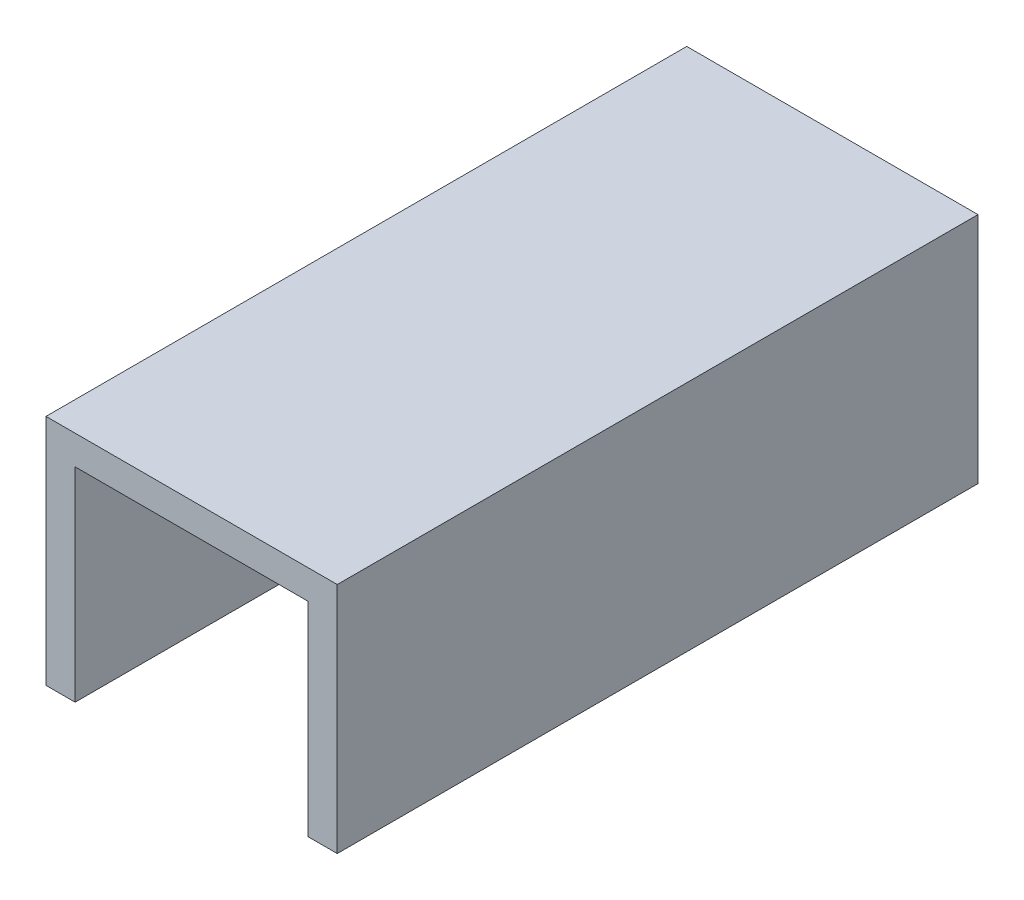
ISO-10303-21;
HEADER;
FILE_DESCRIPTION(('STEP AP214'),'2;1');
FILE_NAME('part.step','',(''),(''),'','','');
FILE_SCHEMA(('AUTOMOTIVE_DESIGN { 1 0 10303 214 1 1 1 1 }'));
ENDSEC;
DATA;
#1=APPLICATION_CONTEXT('core data for automotive mechanical design processes');
#2=APPLICATION_PROTOCOL_DEFINITION('international standard','automotive_design',2000,#1);
#3=PRODUCT_CONTEXT('',#1,'mechanical');
#4=PRODUCT('Part','Part','',(#3));
#5=PRODUCT_RELATED_PRODUCT_CATEGORY('part','',(#4));
#6=PRODUCT_DEFINITION_FORMATION('','',#4);
#7=PRODUCT_DEFINITION_CONTEXT('part definition',#1,'design');
#8=PRODUCT_DEFINITION('design','',#6,#7);
#9=PRODUCT_DEFINITION_SHAPE('','',#8);
#10=(LENGTH_UNIT() NAMED_UNIT(*) SI_UNIT(.MILLI.,.METRE.));
#11=(NAMED_UNIT(*) PLANE_ANGLE_UNIT() SI_UNIT($,.RADIAN.));
#12=(NAMED_UNIT(*) SI_UNIT($,.STERADIAN.) SOLID_ANGLE_UNIT());
#13=UNCERTAINTY_MEASURE_WITH_UNIT(LENGTH_MEASURE(1.E-05),#10,'distance_accuracy_value','');
#14=(GEOMETRIC_REPRESENTATION_CONTEXT(3) GLOBAL_UNCERTAINTY_ASSIGNED_CONTEXT((#13)) GLOBAL_UNIT_ASSIGNED_CONTEXT((#10,
#11,#12)) REPRESENTATION_CONTEXT('',''));
#15=CARTESIAN_POINT('',(0.,0.,0.));
#16=DIRECTION('',(0.,0.,1.));
#17=DIRECTION('',(1.,0.,0.));
#18=AXIS2_PLACEMENT_3D('',#15,#16,#17);
#19=CARTESIAN_POINT('',(25.,20.,110.));
#20=DIRECTION('',(-1.,0.,0.));
#21=DIRECTION('',(0.,-1.,0.));
#22=AXIS2_PLACEMENT_3D('',#19,#20,#21);
#23=PLANE('',#22);
#24=DIRECTION('',(0.,1.,0.));
#25=VECTOR('',#24,1.);
#26=CARTESIAN_POINT('',(25.,20.,0.));
#27=LINE('',#26,#25);
#28=CARTESIAN_POINT('',(25.,-20.,0.));
#29=VERTEX_POINT('',#28);
#30=CARTESIAN_POINT('',(25.,20.,0.));
#31=VERTEX_POINT('',#30);
#32=EDGE_CURVE('E160',#29,#31,#27,.T.);
#33=ORIENTED_EDGE('',*,*,#32,.T.);
#34=DIRECTION('',(0.,0.,-1.));
#35=VECTOR('',#34,1.);
#36=CARTESIAN_POINT('',(25.,20.,110.));
#37=LINE('',#36,#35);
#38=CARTESIAN_POINT('',(25.,20.,110.));
#39=VERTEX_POINT('',#38);
#40=EDGE_CURVE('E11',#39,#31,#37,.T.);
#41=ORIENTED_EDGE('',*,*,#40,.F.);
#42=DIRECTION('',(0.,1.,0.));
#43=VECTOR('',#42,1.);
#44=CARTESIAN_POINT('',(25.,20.,110.));
#45=LINE('',#44,#43);
#46=CARTESIAN_POINT('',(25.,-20.,110.));
#47=VERTEX_POINT('',#46);
#48=EDGE_CURVE('E166',#47,#39,#45,.T.);
#49=ORIENTED_EDGE('',*,*,#48,.F.);
#50=DIRECTION('',(0.,0.,-1.));
#51=VECTOR('',#50,1.);
#52=CARTESIAN_POINT('',(25.,-20.,110.));
#53=LINE('',#52,#51);
#54=EDGE_CURVE('E177',#47,#29,#53,.T.);
#55=ORIENTED_EDGE('',*,*,#54,.T.);
#56=EDGE_LOOP('',(#33,#41,#49,#55));
#57=FACE_BOUND('',#56,.T.);
#58=ADVANCED_FACE('F43',(#57),#23,.F.);
#59=CARTESIAN_POINT('',(-25.,20.,110.));
#60=DIRECTION('',(0.,-1.,0.));
#61=DIRECTION('',(0.,0.,-1.));
#62=AXIS2_PLACEMENT_3D('',#59,#60,#61);
#63=PLANE('',#62);
#64=DIRECTION('',(-1.,0.,0.));
#65=VECTOR('',#64,1.);
#66=CARTESIAN_POINT('',(-25.,20.,0.));
#67=LINE('',#66,#65);
#68=CARTESIAN_POINT('',(-25.,20.,0.));
#69=VERTEX_POINT('',#68);
#70=EDGE_CURVE('E181',#31,#69,#67,.T.);
#71=ORIENTED_EDGE('',*,*,#70,.T.);
#72=DIRECTION('',(0.,0.,-1.));
#73=VECTOR('',#72,1.);
#74=CARTESIAN_POINT('',(-25.,20.,110.));
#75=LINE('',#74,#73);
#76=CARTESIAN_POINT('',(-25.,20.,110.));
#77=VERTEX_POINT('',#76);
#78=EDGE_CURVE('E51',#77,#69,#75,.T.);
#79=ORIENTED_EDGE('',*,*,#78,.F.);
#80=DIRECTION('',(-1.,0.,0.));
#81=VECTOR('',#80,1.);
#82=CARTESIAN_POINT('',(-25.,20.,110.));
#83=LINE('',#82,#81);
#84=EDGE_CURVE('E95',#39,#77,#83,.T.);
#85=ORIENTED_EDGE('',*,*,#84,.F.);
#86=ORIENTED_EDGE('',*,*,#40,.T.);
#87=EDGE_LOOP('',(#71,#79,#85,#86));
#88=FACE_BOUND('',#87,.T.);
#89=ADVANCED_FACE('F222',(#88),#63,.F.);
#90=CARTESIAN_POINT('',(-25.,20.,110.));
#91=DIRECTION('',(1.,0.,0.));
#92=DIRECTION('',(0.,1.,0.));
#93=AXIS2_PLACEMENT_3D('',#90,#91,#92);
#94=PLANE('',#93);
#95=DIRECTION('',(0.,-1.,0.));
#96=VECTOR('',#95,1.);
#97=CARTESIAN_POINT('',(-25.,20.,0.));
#98=LINE('',#97,#96);
#99=CARTESIAN_POINT('',(-25.,-20.,0.));
#100=VERTEX_POINT('',#99);
#101=EDGE_CURVE('E184',#69,#100,#98,.T.);
#102=ORIENTED_EDGE('',*,*,#101,.T.);
#103=DIRECTION('',(0.,0.,-1.));
#104=VECTOR('',#103,1.);
#105=CARTESIAN_POINT('',(-25.,-20.,110.));
#106=LINE('',#105,#104);
#107=CARTESIAN_POINT('',(-25.,-20.,110.));
#108=VERTEX_POINT('',#107);
#109=EDGE_CURVE('E191',#108,#100,#106,.T.);
#110=ORIENTED_EDGE('',*,*,#109,.F.);
#111=DIRECTION('',(0.,-1.,0.));
#112=VECTOR('',#111,1.);
#113=CARTESIAN_POINT('',(-25.,20.,110.));
#114=LINE('',#113,#112);
#115=EDGE_CURVE('E171',#77,#108,#114,.T.);
#116=ORIENTED_EDGE('',*,*,#115,.F.);
#117=ORIENTED_EDGE('',*,*,#78,.T.);
#118=EDGE_LOOP('',(#102,#110,#116,#117));
#119=FACE_BOUND('',#118,.T.);
#120=ADVANCED_FACE('F198',(#119),#94,.F.);
#121=CARTESIAN_POINT('',(-25.,-20.,110.));
#122=DIRECTION('',(0.,1.,0.));
#123=DIRECTION('',(0.,0.,1.));
#124=AXIS2_PLACEMENT_3D('',#121,#122,#123);
#125=PLANE('',#124);
#126=DIRECTION('',(1.,0.,0.));
#127=VECTOR('',#126,1.);
#128=CARTESIAN_POINT('',(-20.,-20.,5.));
#129=LINE('',#128,#127);
#130=CARTESIAN_POINT('',(-20.,-20.,5.));
#131=VERTEX_POINT('',#130);
#132=CARTESIAN_POINT('',(20.,-20.,5.));
#133=VERTEX_POINT('',#132);
#134=EDGE_CURVE('E135',#131,#133,#129,.T.);
#135=ORIENTED_EDGE('',*,*,#134,.F.);
#136=DIRECTION('',(0.,0.,1.));
#137=VECTOR('',#136,1.);
#138=CARTESIAN_POINT('',(-20.,-20.,5.));
#139=LINE('',#138,#137);
#140=CARTESIAN_POINT('',(-20.,-20.,110.));
#141=VERTEX_POINT('',#140);
#142=EDGE_CURVE('E118',#131,#141,#139,.T.);
#143=ORIENTED_EDGE('',*,*,#142,.T.);
#144=DIRECTION('',(1.,0.,0.));
#145=VECTOR('',#144,1.);
#146=CARTESIAN_POINT('',(-25.,-20.,110.));
#147=LINE('',#146,#145);
#148=EDGE_CURVE('E174',#108,#141,#147,.T.);
#149=ORIENTED_EDGE('',*,*,#148,.F.);
#150=ORIENTED_EDGE('',*,*,#109,.T.);
#151=DIRECTION('',(1.,0.,0.));
#152=VECTOR('',#151,1.);
#153=CARTESIAN_POINT('',(-25.,-20.,0.));
#154=LINE('',#153,#152);
#155=EDGE_CURVE('E88',#100,#29,#154,.T.);
#156=ORIENTED_EDGE('',*,*,#155,.T.);
#157=ORIENTED_EDGE('',*,*,#54,.F.);
#158=CARTESIAN_POINT('',(20.,-20.,110.));
#159=VERTEX_POINT('',#158);
#160=EDGE_CURVE('E66',#159,#47,#147,.T.);
#161=ORIENTED_EDGE('',*,*,#160,.F.);
#162=DIRECTION('',(0.,0.,1.));
#163=VECTOR('',#162,1.);
#164=CARTESIAN_POINT('',(20.,-20.,5.));
#165=LINE('',#164,#163);
#166=EDGE_CURVE('E58',#133,#159,#165,.T.);
#167=ORIENTED_EDGE('',*,*,#166,.F.);
#168=EDGE_LOOP('',(#135,#143,#149,#150,#156,#157,#161,#167));
#169=FACE_BOUND('',#168,.T.);
#170=ADVANCED_FACE('F140',(#169),#125,.F.);
#171=CARTESIAN_POINT('',(0.,0.,110.));
#172=DIRECTION('',(0.,0.,1.));
#173=DIRECTION('',(1.,0.,0.));
#174=AXIS2_PLACEMENT_3D('',#171,#172,#173);
#175=PLANE('',#174);
#176=DIRECTION('',(0.,-1.,0.));
#177=VECTOR('',#176,1.);
#178=CARTESIAN_POINT('',(-20.,-20.,110.));
#179=LINE('',#178,#177);
#180=CARTESIAN_POINT('',(-20.,15.,110.));
#181=VERTEX_POINT('',#180);
#182=EDGE_CURVE('E124',#181,#141,#179,.T.);
#183=ORIENTED_EDGE('',*,*,#182,.F.);
#184=DIRECTION('',(-1.,0.,0.));
#185=VECTOR('',#184,1.);
#186=CARTESIAN_POINT('',(-20.,15.,110.));
#187=LINE('',#186,#185);
#188=CARTESIAN_POINT('',(20.,15.,110.));
#189=VERTEX_POINT('',#188);
#190=EDGE_CURVE('E138',#189,#181,#187,.T.);
#191=ORIENTED_EDGE('',*,*,#190,.F.);
#192=DIRECTION('',(0.,1.,0.));
#193=VECTOR('',#192,1.);
#194=CARTESIAN_POINT('',(20.,-20.,110.));
#195=LINE('',#194,#193);
#196=EDGE_CURVE('E151',#159,#189,#195,.T.);
#197=ORIENTED_EDGE('',*,*,#196,.F.);
#198=ORIENTED_EDGE('',*,*,#160,.T.);
#199=ORIENTED_EDGE('',*,*,#48,.T.);
#200=ORIENTED_EDGE('',*,*,#84,.T.);
#201=ORIENTED_EDGE('',*,*,#115,.T.);
#202=ORIENTED_EDGE('',*,*,#148,.T.);
#203=EDGE_LOOP('',(#183,#191,#197,#198,#199,#200,#201,#202));
#204=FACE_BOUND('',#203,.T.);
#205=ADVANCED_FACE('F207',(#204),#175,.T.);
#206=CARTESIAN_POINT('',(0.,0.,0.));
#207=DIRECTION('',(0.,0.,1.));
#208=DIRECTION('',(1.,0.,0.));
#209=AXIS2_PLACEMENT_3D('',#206,#207,#208);
#210=PLANE('',#209);
#211=ORIENTED_EDGE('',*,*,#32,.F.);
#212=ORIENTED_EDGE('',*,*,#155,.F.);
#213=ORIENTED_EDGE('',*,*,#101,.F.);
#214=ORIENTED_EDGE('',*,*,#70,.F.);
#215=EDGE_LOOP('',(#211,#212,#213,#214));
#216=FACE_BOUND('',#215,.T.);
#217=ADVANCED_FACE('F202',(#216),#210,.F.);
#218=CARTESIAN_POINT('',(-20.,-20.,5.));
#219=DIRECTION('',(-1.,0.,0.));
#220=DIRECTION('',(0.,-1.,0.));
#221=AXIS2_PLACEMENT_3D('',#218,#219,#220);
#222=PLANE('',#221);
#223=ORIENTED_EDGE('',*,*,#182,.T.);
#224=ORIENTED_EDGE('',*,*,#142,.F.);
#225=DIRECTION('',(0.,-1.,0.));
#226=VECTOR('',#225,1.);
#227=CARTESIAN_POINT('',(-20.,-20.,5.));
#228=LINE('',#227,#226);
#229=CARTESIAN_POINT('',(-20.,15.,5.));
#230=VERTEX_POINT('',#229);
#231=EDGE_CURVE('E121',#230,#131,#228,.T.);
#232=ORIENTED_EDGE('',*,*,#231,.F.);
#233=DIRECTION('',(0.,0.,1.));
#234=VECTOR('',#233,1.);
#235=CARTESIAN_POINT('',(-20.,15.,5.));
#236=LINE('',#235,#234);
#237=EDGE_CURVE('E157',#230,#181,#236,.T.);
#238=ORIENTED_EDGE('',*,*,#237,.T.);
#239=EDGE_LOOP('',(#223,#224,#232,#238));
#240=FACE_BOUND('',#239,.T.);
#241=ADVANCED_FACE('F120',(#240),#222,.F.);
#242=CARTESIAN_POINT('',(-20.,15.,5.));
#243=DIRECTION('',(0.,1.,0.));
#244=DIRECTION('',(-1.,0.,0.));
#245=AXIS2_PLACEMENT_3D('',#242,#243,#244);
#246=PLANE('',#245);
#247=ORIENTED_EDGE('',*,*,#190,.T.);
#248=ORIENTED_EDGE('',*,*,#237,.F.);
#249=DIRECTION('',(-1.,0.,0.));
#250=VECTOR('',#249,1.);
#251=CARTESIAN_POINT('',(-20.,15.,5.));
#252=LINE('',#251,#250);
#253=CARTESIAN_POINT('',(20.,15.,5.));
#254=VERTEX_POINT('',#253);
#255=EDGE_CURVE('E129',#254,#230,#252,.T.);
#256=ORIENTED_EDGE('',*,*,#255,.F.);
#257=DIRECTION('',(0.,0.,1.));
#258=VECTOR('',#257,1.);
#259=CARTESIAN_POINT('',(20.,15.,5.));
#260=LINE('',#259,#258);
#261=EDGE_CURVE('E161',#254,#189,#260,.T.);
#262=ORIENTED_EDGE('',*,*,#261,.T.);
#263=EDGE_LOOP('',(#247,#248,#256,#262));
#264=FACE_BOUND('',#263,.T.);
#265=ADVANCED_FACE('F210',(#264),#246,.F.);
#266=CARTESIAN_POINT('',(20.,-20.,5.));
#267=DIRECTION('',(1.,0.,0.));
#268=DIRECTION('',(0.,1.,0.));
#269=AXIS2_PLACEMENT_3D('',#266,#267,#268);
#270=PLANE('',#269);
#271=ORIENTED_EDGE('',*,*,#196,.T.);
#272=ORIENTED_EDGE('',*,*,#261,.F.);
#273=DIRECTION('',(0.,1.,0.));
#274=VECTOR('',#273,1.);
#275=CARTESIAN_POINT('',(20.,-20.,5.));
#276=LINE('',#275,#274);
#277=EDGE_CURVE('E142',#133,#254,#276,.T.);
#278=ORIENTED_EDGE('',*,*,#277,.F.);
#279=ORIENTED_EDGE('',*,*,#166,.T.);
#280=EDGE_LOOP('',(#271,#272,#278,#279));
#281=FACE_BOUND('',#280,.T.);
#282=ADVANCED_FACE('F211',(#281),#270,.F.);
#283=CARTESIAN_POINT('',(0.,0.,5.));
#284=DIRECTION('',(0.,0.,-1.));
#285=DIRECTION('',(-1.,0.,0.));
#286=AXIS2_PLACEMENT_3D('',#283,#284,#285);
#287=PLANE('',#286);
#288=ORIENTED_EDGE('',*,*,#231,.T.);
#289=ORIENTED_EDGE('',*,*,#134,.T.);
#290=ORIENTED_EDGE('',*,*,#277,.T.);
#291=ORIENTED_EDGE('',*,*,#255,.T.);
#292=EDGE_LOOP('',(#288,#289,#290,#291));
#293=FACE_BOUND('',#292,.T.);
#294=ADVANCED_FACE('F133',(#293),#287,.F.);
#295=CLOSED_SHELL('',(#58,#89,#120,#170,#205,#217,#241,#265,#282,#294));
#296=MANIFOLD_SOLID_BREP('B2',#295);
#297=ADVANCED_BREP_SHAPE_REPRESENTATION('',(#18,#296),#14);
#298=SHAPE_DEFINITION_REPRESENTATION(#9,#297);
ENDSEC;
END-ISO-10303-21;
